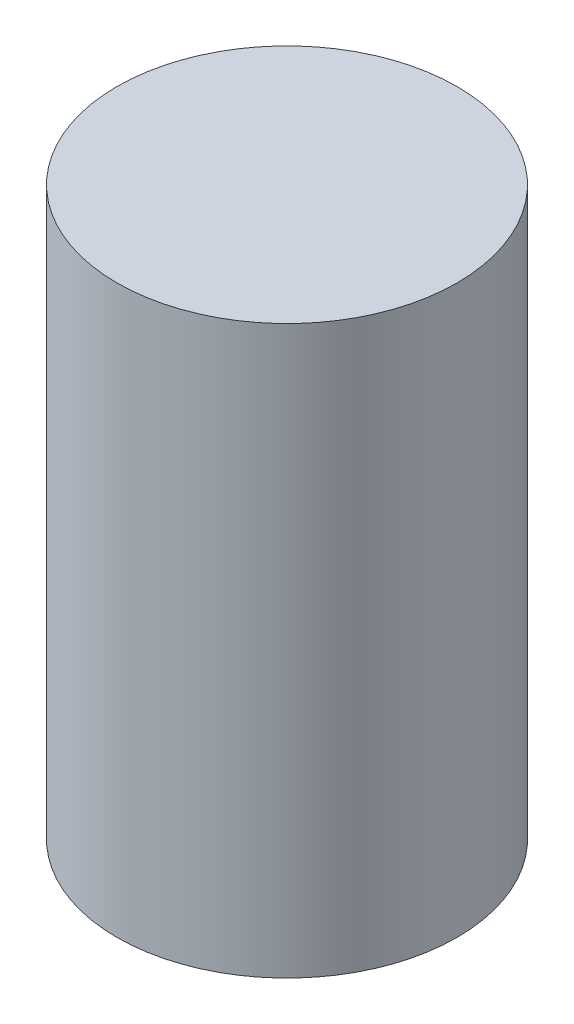
ISO-10303-21;
HEADER;
FILE_DESCRIPTION(('STEP AP214'),'2;1');
FILE_NAME('part.step','',(''),(''),'','','');
FILE_SCHEMA(('AUTOMOTIVE_DESIGN { 1 0 10303 214 1 1 1 1 }'));
ENDSEC;
DATA;
#1=APPLICATION_CONTEXT('core data for automotive mechanical design processes');
#2=APPLICATION_PROTOCOL_DEFINITION('international standard','automotive_design',2000,#1);
#3=PRODUCT_CONTEXT('',#1,'mechanical');
#4=PRODUCT('Part','Part','',(#3));
#5=PRODUCT_RELATED_PRODUCT_CATEGORY('part','',(#4));
#6=PRODUCT_DEFINITION_FORMATION('','',#4);
#7=PRODUCT_DEFINITION_CONTEXT('part definition',#1,'design');
#8=PRODUCT_DEFINITION('design','',#6,#7);
#9=PRODUCT_DEFINITION_SHAPE('','',#8);
#10=(LENGTH_UNIT() NAMED_UNIT(*) SI_UNIT(.MILLI.,.METRE.));
#11=(NAMED_UNIT(*) PLANE_ANGLE_UNIT() SI_UNIT($,.RADIAN.));
#12=(NAMED_UNIT(*) SI_UNIT($,.STERADIAN.) SOLID_ANGLE_UNIT());
#13=UNCERTAINTY_MEASURE_WITH_UNIT(LENGTH_MEASURE(1.E-05),#10,'distance_accuracy_value','');
#14=(GEOMETRIC_REPRESENTATION_CONTEXT(3) GLOBAL_UNCERTAINTY_ASSIGNED_CONTEXT((#13)) GLOBAL_UNIT_ASSIGNED_CONTEXT((#10,
#11,#12)) REPRESENTATION_CONTEXT('',''));
#15=CARTESIAN_POINT('',(0.,0.,0.));
#16=DIRECTION('',(0.,0.,1.));
#17=DIRECTION('',(1.,0.,0.));
#18=AXIS2_PLACEMENT_3D('',#15,#16,#17);
#19=CARTESIAN_POINT('',(0.,0.,0.));
#20=DIRECTION('',(0.,-1.,0.));
#21=DIRECTION('',(0.,0.,-1.));
#22=AXIS2_PLACEMENT_3D('',#19,#20,#21);
#23=PLANE('',#22);
#24=CARTESIAN_POINT('',(0.,0.,0.));
#25=DIRECTION('',(0.,1.,0.));
#26=DIRECTION('',(0.,0.,1.));
#27=AXIS2_PLACEMENT_3D('',#24,#25,#26);
#28=CIRCLE('',#27,4.);
#29=CARTESIAN_POINT('',(0.,0.,4.));
#30=VERTEX_POINT('',#29);
#31=EDGE_CURVE('E51',#30,#30,#28,.T.);
#32=ORIENTED_EDGE('',*,*,#31,.T.);
#33=EDGE_LOOP('',(#32));
#34=FACE_BOUND('',#33,.T.);
#35=CARTESIAN_POINT('',(0.,0.,0.));
#36=DIRECTION('',(0.,-1.,0.));
#37=DIRECTION('',(0.,0.,-1.));
#38=AXIS2_PLACEMENT_3D('',#35,#36,#37);
#39=CIRCLE('',#38,30.);
#40=CARTESIAN_POINT('',(0.,0.,-30.));
#41=VERTEX_POINT('',#40);
#42=EDGE_CURVE('E10',#41,#41,#39,.T.);
#43=ORIENTED_EDGE('',*,*,#42,.T.);
#44=EDGE_LOOP('',(#43));
#45=FACE_BOUND('',#44,.T.);
#46=ADVANCED_FACE('F37',(#34,#45),#23,.T.);
#47=CARTESIAN_POINT('',(0.,0.,0.));
#48=DIRECTION('',(0.,-1.,0.));
#49=DIRECTION('',(0.,0.,-1.));
#50=AXIS2_PLACEMENT_3D('',#47,#48,#49);
#51=CYLINDRICAL_SURFACE('',#50,30.);
#52=CARTESIAN_POINT('',(0.,100.,0.));
#53=DIRECTION('',(0.,-1.,0.));
#54=DIRECTION('',(0.,0.,-1.));
#55=AXIS2_PLACEMENT_3D('',#52,#53,#54);
#56=CIRCLE('',#55,30.);
#57=CARTESIAN_POINT('',(0.,100.,-30.));
#58=VERTEX_POINT('',#57);
#59=EDGE_CURVE('E43',#58,#58,#56,.T.);
#60=ORIENTED_EDGE('',*,*,#59,.T.);
#61=EDGE_LOOP('',(#60));
#62=FACE_BOUND('',#61,.T.);
#63=ORIENTED_EDGE('',*,*,#42,.F.);
#64=EDGE_LOOP('',(#63));
#65=FACE_BOUND('',#64,.T.);
#66=ADVANCED_FACE('F71',(#62,#65),#51,.T.);
#67=CARTESIAN_POINT('',(30.,100.,0.));
#68=DIRECTION('',(0.,1.,0.));
#69=DIRECTION('',(0.,0.,1.));
#70=AXIS2_PLACEMENT_3D('',#67,#68,#69);
#71=PLANE('',#70);
#72=ORIENTED_EDGE('',*,*,#59,.F.);
#73=EDGE_LOOP('',(#72));
#74=FACE_BOUND('',#73,.T.);
#75=ADVANCED_FACE('F61',(#74),#71,.T.);
#76=CARTESIAN_POINT('',(0.,14.,0.));
#77=DIRECTION('',(0.,-1.,0.));
#78=DIRECTION('',(0.,0.,-1.));
#79=AXIS2_PLACEMENT_3D('',#76,#77,#78);
#80=CYLINDRICAL_SURFACE('',#79,4.);
#81=CARTESIAN_POINT('',(0.,14.,0.));
#82=DIRECTION('',(0.,1.,0.));
#83=DIRECTION('',(0.,0.,1.));
#84=AXIS2_PLACEMENT_3D('',#81,#82,#83);
#85=CIRCLE('',#84,4.);
#86=CARTESIAN_POINT('',(0.,14.,4.));
#87=VERTEX_POINT('',#86);
#88=EDGE_CURVE('E47',#87,#87,#85,.T.);
#89=ORIENTED_EDGE('',*,*,#88,.T.);
#90=EDGE_LOOP('',(#89));
#91=FACE_BOUND('',#90,.T.);
#92=ORIENTED_EDGE('',*,*,#31,.F.);
#93=EDGE_LOOP('',(#92));
#94=FACE_BOUND('',#93,.T.);
#95=ADVANCED_FACE('F58',(#91,#94),#80,.F.);
#96=CARTESIAN_POINT('',(0.,14.,0.));
#97=DIRECTION('',(0.,1.,0.));
#98=DIRECTION('',(0.,0.,1.));
#99=AXIS2_PLACEMENT_3D('',#96,#97,#98);
#100=PLANE('',#99);
#101=ORIENTED_EDGE('',*,*,#88,.F.);
#102=EDGE_LOOP('',(#101));
#103=FACE_BOUND('',#102,.T.);
#104=ADVANCED_FACE('F60',(#103),#100,.F.);
#105=CLOSED_SHELL('',(#46,#66,#75,#95,#104));
#106=MANIFOLD_SOLID_BREP('B2',#105);
#107=ADVANCED_BREP_SHAPE_REPRESENTATION('',(#18,#106),#14);
#108=SHAPE_DEFINITION_REPRESENTATION(#9,#107);
ENDSEC;
END-ISO-10303-21;
